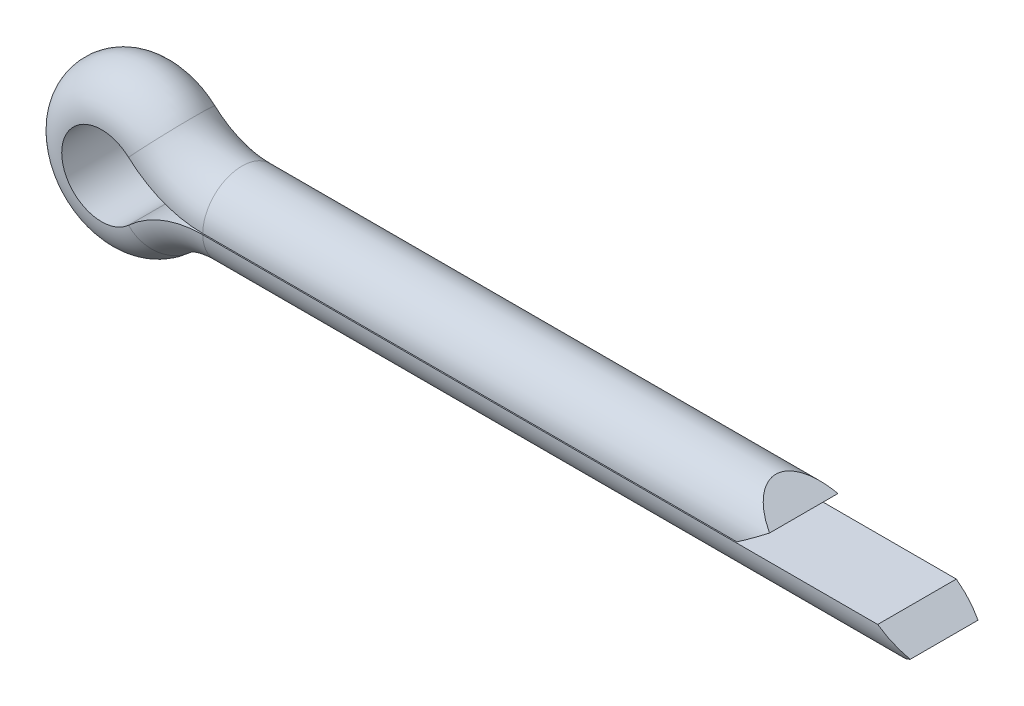
ISO-10303-21;
HEADER;
FILE_DESCRIPTION(('STEP AP214'),'2;1');
FILE_NAME('part.step','',(''),(''),'','','');
FILE_SCHEMA(('AUTOMOTIVE_DESIGN { 1 0 10303 214 1 1 1 1 }'));
ENDSEC;
DATA;
#1=APPLICATION_CONTEXT('core data for automotive mechanical design processes');
#2=APPLICATION_PROTOCOL_DEFINITION('international standard','automotive_design',2000,#1);
#3=PRODUCT_CONTEXT('',#1,'mechanical');
#4=PRODUCT('Part','Part','',(#3));
#5=PRODUCT_RELATED_PRODUCT_CATEGORY('part','',(#4));
#6=PRODUCT_DEFINITION_FORMATION('','',#4);
#7=PRODUCT_DEFINITION_CONTEXT('part definition',#1,'design');
#8=PRODUCT_DEFINITION('design','',#6,#7);
#9=PRODUCT_DEFINITION_SHAPE('','',#8);
#10=(LENGTH_UNIT() NAMED_UNIT(*) SI_UNIT(.MILLI.,.METRE.));
#11=(NAMED_UNIT(*) PLANE_ANGLE_UNIT() SI_UNIT($,.RADIAN.));
#12=(NAMED_UNIT(*) SI_UNIT($,.STERADIAN.) SOLID_ANGLE_UNIT());
#13=UNCERTAINTY_MEASURE_WITH_UNIT(LENGTH_MEASURE(1.E-05),#10,'distance_accuracy_value','');
#14=(GEOMETRIC_REPRESENTATION_CONTEXT(3) GLOBAL_UNCERTAINTY_ASSIGNED_CONTEXT((#13)) GLOBAL_UNIT_ASSIGNED_CONTEXT((#10,
#11,#12)) REPRESENTATION_CONTEXT('',''));
#15=CARTESIAN_POINT('',(0.,0.,0.));
#16=DIRECTION('',(0.,0.,1.));
#17=DIRECTION('',(1.,0.,0.));
#18=AXIS2_PLACEMENT_3D('',#15,#16,#17);
#19=CARTESIAN_POINT('',(1.80000000000001,0.,0.));
#20=DIRECTION('',(1.,0.,0.));
#21=DIRECTION('',(0.,0.,-1.));
#22=AXIS2_PLACEMENT_3D('',#19,#20,#21);
#23=CYLINDRICAL_SURFACE('',#22,0.7);
#24=CARTESIAN_POINT('',(13.8036492353313,0.,0.));
#25=DIRECTION('',(-0.58174128185548,-0.813373887572709,0.));
#26=DIRECTION('',(0.81337388757271,-0.58174128185548,0.));
#27=AXIS2_PLACEMENT_3D('',#24,#25,#26);
#28=ELLIPSE('',#27,1.20328404023062,0.7);
#29=CARTESIAN_POINT('',(14.3,-0.355,-0.603303406255912));
#30=VERTEX_POINT('',#29);
#31=CARTESIAN_POINT('',(13.8176309470121,-0.0100000000000003,-0.699928567783885));
#32=VERTEX_POINT('',#31);
#33=EDGE_CURVE('E175',#30,#32,#28,.F.);
#34=ORIENTED_EDGE('',*,*,#33,.F.);
#35=CARTESIAN_POINT('',(14.8179427774436,0.,0.));
#36=DIRECTION('',(-0.565354203493355,0.824848243371103,0.));
#37=DIRECTION('',(0.824848243371103,0.565354203493355,0.));
#38=AXIS2_PLACEMENT_3D('',#35,#36,#37);
#39=ELLIPSE('',#38,1.23816183849817,0.7);
#40=CARTESIAN_POINT('',(14.3,-0.355,0.603303406255911));
#41=VERTEX_POINT('',#40);
#42=EDGE_CURVE('E171',#41,#30,#39,.F.);
#43=ORIENTED_EDGE('',*,*,#42,.F.);
#44=CARTESIAN_POINT('',(13.8176309470121,-0.0100000000000004,0.699928567783885));
#45=VERTEX_POINT('',#44);
#46=EDGE_CURVE('E118',#45,#41,#28,.F.);
#47=ORIENTED_EDGE('',*,*,#46,.F.);
#48=DIRECTION('',(1.,0.,0.));
#49=VECTOR('',#48,1.);
#50=CARTESIAN_POINT('',(1.80000000000001,-0.0100000000000004,0.699928567783885));
#51=LINE('',#50,#49);
#52=CARTESIAN_POINT('',(1.80000000000001,-0.0100000000000004,0.699928567783885));
#53=VERTEX_POINT('',#52);
#54=EDGE_CURVE('E46',#53,#45,#51,.T.);
#55=ORIENTED_EDGE('',*,*,#54,.F.);
#56=CARTESIAN_POINT('',(1.80000000000001,0.,0.));
#57=DIRECTION('',(1.,0.,0.));
#58=DIRECTION('',(0.,0.,1.));
#59=AXIS2_PLACEMENT_3D('',#56,#57,#58);
#60=CIRCLE('',#59,0.7);
#61=CARTESIAN_POINT('',(1.80000000000001,-0.0100000000000004,-0.699928567783885));
#62=VERTEX_POINT('',#61);
#63=EDGE_CURVE('E153',#53,#62,#60,.T.);
#64=ORIENTED_EDGE('',*,*,#63,.T.);
#65=DIRECTION('',(1.,0.,0.));
#66=VECTOR('',#65,1.);
#67=CARTESIAN_POINT('',(1.80000000000001,-0.0100000000000004,-0.699928567783885));
#68=LINE('',#67,#66);
#69=EDGE_CURVE('E11',#62,#32,#68,.T.);
#70=ORIENTED_EDGE('',*,*,#69,.T.);
#71=EDGE_LOOP('',(#34,#43,#47,#55,#64,#70));
#72=FACE_BOUND('',#71,.T.);
#73=ADVANCED_FACE('F38',(#72),#23,.T.);
#74=CARTESIAN_POINT('',(1.80000000000001,-0.0100000000000004,-0.699928567783885));
#75=DIRECTION('',(0.,1.,0.));
#76=DIRECTION('',(0.,0.,1.));
#77=AXIS2_PLACEMENT_3D('',#74,#75,#76);
#78=PLANE('',#77);
#79=DIRECTION('',(0.,0.,1.));
#80=VECTOR('',#79,1.);
#81=CARTESIAN_POINT('',(13.8176309470121,-0.0100000000000004,-0.699928567783885));
#82=LINE('',#81,#80);
#83=EDGE_CURVE('E53',#32,#45,#82,.T.);
#84=ORIENTED_EDGE('',*,*,#83,.F.);
#85=ORIENTED_EDGE('',*,*,#69,.F.);
#86=DIRECTION('',(0.,0.,1.));
#87=VECTOR('',#86,1.);
#88=CARTESIAN_POINT('',(1.80000000000001,-0.0100000000000004,-0.699928567783885));
#89=LINE('',#88,#87);
#90=EDGE_CURVE('E156',#62,#53,#89,.T.);
#91=ORIENTED_EDGE('',*,*,#90,.T.);
#92=ORIENTED_EDGE('',*,*,#54,.T.);
#93=EDGE_LOOP('',(#84,#85,#91,#92));
#94=FACE_BOUND('',#93,.T.);
#95=ADVANCED_FACE('F40',(#94),#78,.T.);
#96=CARTESIAN_POINT('',(1.8,-1.96428571428571,0.));
#97=DIRECTION('',(0.,0.,-1.));
#98=DIRECTION('',(-1.,0.,0.));
#99=AXIS2_PLACEMENT_3D('',#96,#97,#98);
#100=CYLINDRICAL_SURFACE('',#99,1.95428571428571);
#101=DIRECTION('',(0.,0.,1.));
#102=VECTOR('',#101,1.);
#103=CARTESIAN_POINT('',(0.479678284182313,-0.523458445040208,-0.699928567783885));
#104=LINE('',#103,#102);
#105=CARTESIAN_POINT('',(0.479678284182313,-0.523458445040208,-0.699928567783885));
#106=VERTEX_POINT('',#105);
#107=CARTESIAN_POINT('',(0.479678284182313,-0.523458445040208,0.699928567783885));
#108=VERTEX_POINT('',#107);
#109=EDGE_CURVE('E144',#106,#108,#104,.T.);
#110=ORIENTED_EDGE('',*,*,#109,.T.);
#111=CARTESIAN_POINT('',(1.8,-1.96428571428571,0.699928567783885));
#112=DIRECTION('',(0.,0.,-1.));
#113=DIRECTION('',(-1.,0.,0.));
#114=AXIS2_PLACEMENT_3D('',#111,#112,#113);
#115=CIRCLE('',#114,1.95428571428571);
#116=EDGE_CURVE('E159',#108,#53,#115,.T.);
#117=ORIENTED_EDGE('',*,*,#116,.T.);
#118=ORIENTED_EDGE('',*,*,#90,.F.);
#119=CARTESIAN_POINT('',(1.8,-1.96428571428571,-0.699928567783885));
#120=DIRECTION('',(0.,0.,-1.));
#121=DIRECTION('',(-1.,0.,0.));
#122=AXIS2_PLACEMENT_3D('',#119,#120,#121);
#123=CIRCLE('',#122,1.95428571428571);
#124=EDGE_CURVE('E162',#106,#62,#123,.T.);
#125=ORIENTED_EDGE('',*,*,#124,.F.);
#126=EDGE_LOOP('',(#110,#117,#118,#125));
#127=FACE_BOUND('',#126,.T.);
#128=ADVANCED_FACE('F195',(#127),#100,.T.);
#129=CARTESIAN_POINT('',(1.8,-1.96428571428571,0.));
#130=DIRECTION('',(0.,0.,-1.));
#131=DIRECTION('',(-1.,0.,0.));
#132=AXIS2_PLACEMENT_3D('',#129,#130,#131);
#133=TOROIDAL_SURFACE('',#132,1.96428571428571,0.7);
#134=CARTESIAN_POINT('',(0.472922252010731,-0.516085790884712,0.));
#135=DIRECTION('',(0.737265415549588,0.675603217158188,0.));
#136=DIRECTION('',(0.,0.,1.));
#137=AXIS2_PLACEMENT_3D('',#134,#135,#136);
#138=CIRCLE('',#137,0.7);
#139=EDGE_CURVE('E141',#108,#106,#138,.T.);
#140=ORIENTED_EDGE('',*,*,#139,.T.);
#141=ORIENTED_EDGE('',*,*,#124,.T.);
#142=ORIENTED_EDGE('',*,*,#63,.F.);
#143=ORIENTED_EDGE('',*,*,#116,.F.);
#144=EDGE_LOOP('',(#140,#141,#142,#143));
#145=FACE_BOUND('',#144,.T.);
#146=ADVANCED_FACE('F197',(#145),#133,.T.);
#147=CARTESIAN_POINT('',(0.,0.,0.));
#148=DIRECTION('',(0.,0.,1.));
#149=DIRECTION('',(1.,0.,0.));
#150=AXIS2_PLACEMENT_3D('',#147,#148,#149);
#151=CYLINDRICAL_SURFACE('',#150,0.710000000000001);
#152=DIRECTION('',(0.,0.,1.));
#153=VECTOR('',#152,1.);
#154=CARTESIAN_POINT('',(0.479678284182307,0.523458445040215,-0.699928567783885));
#155=LINE('',#154,#153);
#156=CARTESIAN_POINT('',(0.479678284182307,0.523458445040215,-0.699928567783885));
#157=VERTEX_POINT('',#156);
#158=CARTESIAN_POINT('',(0.479678284182307,0.523458445040215,0.699928567783885));
#159=VERTEX_POINT('',#158);
#160=EDGE_CURVE('E128',#157,#159,#155,.T.);
#161=ORIENTED_EDGE('',*,*,#160,.T.);
#162=CARTESIAN_POINT('',(0.,0.,0.699928567783885));
#163=DIRECTION('',(0.,0.,1.));
#164=DIRECTION('',(1.,0.,0.));
#165=AXIS2_PLACEMENT_3D('',#162,#163,#164);
#166=CIRCLE('',#165,0.710000000000001);
#167=EDGE_CURVE('E147',#159,#108,#166,.T.);
#168=ORIENTED_EDGE('',*,*,#167,.T.);
#169=ORIENTED_EDGE('',*,*,#109,.F.);
#170=CARTESIAN_POINT('',(0.,0.,-0.699928567783885));
#171=DIRECTION('',(0.,0.,1.));
#172=DIRECTION('',(1.,0.,0.));
#173=AXIS2_PLACEMENT_3D('',#170,#171,#172);
#174=CIRCLE('',#173,0.710000000000001);
#175=EDGE_CURVE('E150',#157,#106,#174,.T.);
#176=ORIENTED_EDGE('',*,*,#175,.F.);
#177=EDGE_LOOP('',(#161,#168,#169,#176));
#178=FACE_BOUND('',#177,.T.);
#179=ADVANCED_FACE('F192',(#178),#151,.F.);
#180=CARTESIAN_POINT('',(0.,0.,0.));
#181=DIRECTION('',(0.,0.,1.));
#182=DIRECTION('',(1.,0.,0.));
#183=AXIS2_PLACEMENT_3D('',#180,#181,#182);
#184=TOROIDAL_SURFACE('',#183,0.700000000000001,0.7);
#185=CARTESIAN_POINT('',(0.472922252010725,0.516085790884719,0.));
#186=DIRECTION('',(-0.737265415549598,0.675603217158177,0.));
#187=DIRECTION('',(0.,0.,1.));
#188=AXIS2_PLACEMENT_3D('',#185,#186,#187);
#189=CIRCLE('',#188,0.7);
#190=EDGE_CURVE('E124',#159,#157,#189,.T.);
#191=ORIENTED_EDGE('',*,*,#190,.T.);
#192=ORIENTED_EDGE('',*,*,#175,.T.);
#193=ORIENTED_EDGE('',*,*,#139,.F.);
#194=ORIENTED_EDGE('',*,*,#167,.F.);
#195=EDGE_LOOP('',(#191,#192,#193,#194));
#196=FACE_BOUND('',#195,.T.);
#197=ADVANCED_FACE('F189',(#196),#184,.T.);
#198=CARTESIAN_POINT('',(1.8,1.96428571428571,0.));
#199=DIRECTION('',(0.,0.,-1.));
#200=DIRECTION('',(-1.,0.,0.));
#201=AXIS2_PLACEMENT_3D('',#198,#199,#200);
#202=CYLINDRICAL_SURFACE('',#201,1.95428571428571);
#203=DIRECTION('',(0.,0.,1.));
#204=VECTOR('',#203,1.);
#205=CARTESIAN_POINT('',(1.8,0.0100000000000001,-0.699928567783885));
#206=LINE('',#205,#204);
#207=CARTESIAN_POINT('',(1.8,0.0100000000000001,-0.699928567783885));
#208=VERTEX_POINT('',#207);
#209=CARTESIAN_POINT('',(1.8,0.0100000000000001,0.699928567783885));
#210=VERTEX_POINT('',#209);
#211=EDGE_CURVE('E123',#208,#210,#206,.T.);
#212=ORIENTED_EDGE('',*,*,#211,.T.);
#213=CARTESIAN_POINT('',(1.8,1.96428571428571,0.699928567783885));
#214=DIRECTION('',(0.,0.,-1.));
#215=DIRECTION('',(-1.,0.,0.));
#216=AXIS2_PLACEMENT_3D('',#213,#214,#215);
#217=CIRCLE('',#216,1.95428571428571);
#218=EDGE_CURVE('E135',#210,#159,#217,.T.);
#219=ORIENTED_EDGE('',*,*,#218,.T.);
#220=ORIENTED_EDGE('',*,*,#160,.F.);
#221=CARTESIAN_POINT('',(1.8,1.96428571428571,-0.699928567783885));
#222=DIRECTION('',(0.,0.,-1.));
#223=DIRECTION('',(-1.,0.,0.));
#224=AXIS2_PLACEMENT_3D('',#221,#222,#223);
#225=CIRCLE('',#224,1.95428571428571);
#226=EDGE_CURVE('E138',#208,#157,#225,.T.);
#227=ORIENTED_EDGE('',*,*,#226,.F.);
#228=EDGE_LOOP('',(#212,#219,#220,#227));
#229=FACE_BOUND('',#228,.T.);
#230=ADVANCED_FACE('F183',(#229),#202,.T.);
#231=CARTESIAN_POINT('',(1.8,1.96428571428571,0.));
#232=DIRECTION('',(0.,0.,-1.));
#233=DIRECTION('',(-1.,0.,0.));
#234=AXIS2_PLACEMENT_3D('',#231,#232,#233);
#235=TOROIDAL_SURFACE('',#234,1.96428571428571,0.7);
#236=CARTESIAN_POINT('',(1.8,0.,0.));
#237=DIRECTION('',(-1.,0.,0.));
#238=DIRECTION('',(0.,0.,1.));
#239=AXIS2_PLACEMENT_3D('',#236,#237,#238);
#240=CIRCLE('',#239,0.7);
#241=EDGE_CURVE('E177',#210,#208,#240,.T.);
#242=ORIENTED_EDGE('',*,*,#241,.T.);
#243=ORIENTED_EDGE('',*,*,#226,.T.);
#244=ORIENTED_EDGE('',*,*,#190,.F.);
#245=ORIENTED_EDGE('',*,*,#218,.F.);
#246=EDGE_LOOP('',(#242,#243,#244,#245));
#247=FACE_BOUND('',#246,.T.);
#248=ADVANCED_FACE('F186',(#247),#235,.T.);
#249=CARTESIAN_POINT('',(1.8,0.,0.));
#250=DIRECTION('',(1.,0.,0.));
#251=DIRECTION('',(0.,1.,0.));
#252=AXIS2_PLACEMENT_3D('',#249,#250,#251);
#253=CYLINDRICAL_SURFACE('',#252,0.7);
#254=DIRECTION('',(1.,0.,0.));
#255=VECTOR('',#254,1.);
#256=CARTESIAN_POINT('',(1.8,0.0100000000000001,0.699928567783885));
#257=LINE('',#256,#255);
#258=CARTESIAN_POINT('',(11.311237097342,0.01,0.699928567783885));
#259=VERTEX_POINT('',#258);
#260=EDGE_CURVE('E125',#210,#259,#257,.T.);
#261=ORIENTED_EDGE('',*,*,#260,.T.);
#262=CARTESIAN_POINT('',(11.2966471599492,0.,0.));
#263=DIRECTION('',(-0.565354203493355,0.824848243371103,0.));
#264=DIRECTION('',(0.824848243371103,0.565354203493355,0.));
#265=AXIS2_PLACEMENT_3D('',#262,#263,#264);
#266=ELLIPSE('',#265,1.23816183849817,0.7);
#267=CARTESIAN_POINT('',(11.8,0.345,0.609077170808428));
#268=VERTEX_POINT('',#267);
#269=EDGE_CURVE('E61',#259,#268,#266,.T.);
#270=ORIENTED_EDGE('',*,*,#269,.T.);
#271=CARTESIAN_POINT('',(12.2823690529879,0.,0.));
#272=DIRECTION('',(-0.58174128185548,-0.81337388757271,0.));
#273=DIRECTION('',(0.81337388757271,-0.58174128185548,0.));
#274=AXIS2_PLACEMENT_3D('',#271,#272,#273);
#275=ELLIPSE('',#274,1.20328404023062,0.7);
#276=CARTESIAN_POINT('',(11.8,0.345,-0.609077170808429));
#277=VERTEX_POINT('',#276);
#278=EDGE_CURVE('E111',#268,#277,#275,.T.);
#279=ORIENTED_EDGE('',*,*,#278,.T.);
#280=CARTESIAN_POINT('',(11.311237097342,0.0099999999999996,-0.699928567783885));
#281=VERTEX_POINT('',#280);
#282=EDGE_CURVE('E105',#277,#281,#266,.T.);
#283=ORIENTED_EDGE('',*,*,#282,.T.);
#284=DIRECTION('',(1.,0.,0.));
#285=VECTOR('',#284,1.);
#286=CARTESIAN_POINT('',(1.8,0.0100000000000001,-0.699928567783885));
#287=LINE('',#286,#285);
#288=EDGE_CURVE('E117',#208,#281,#287,.T.);
#289=ORIENTED_EDGE('',*,*,#288,.F.);
#290=ORIENTED_EDGE('',*,*,#241,.F.);
#291=EDGE_LOOP('',(#261,#270,#279,#283,#289,#290));
#292=FACE_BOUND('',#291,.T.);
#293=ADVANCED_FACE('F115',(#292),#253,.T.);
#294=CARTESIAN_POINT('',(1.8,0.0100000000000001,-0.699928567783885));
#295=DIRECTION('',(0.,1.,0.));
#296=DIRECTION('',(-1.,0.,0.));
#297=AXIS2_PLACEMENT_3D('',#294,#295,#296);
#298=PLANE('',#297);
#299=ORIENTED_EDGE('',*,*,#288,.T.);
#300=DIRECTION('',(0.,0.,1.));
#301=VECTOR('',#300,1.);
#302=CARTESIAN_POINT('',(11.311237097342,0.01,-0.699928567783885));
#303=LINE('',#302,#301);
#304=EDGE_CURVE('E102',#281,#259,#303,.T.);
#305=ORIENTED_EDGE('',*,*,#304,.T.);
#306=ORIENTED_EDGE('',*,*,#260,.F.);
#307=ORIENTED_EDGE('',*,*,#211,.F.);
#308=EDGE_LOOP('',(#299,#305,#306,#307));
#309=FACE_BOUND('',#308,.T.);
#310=ADVANCED_FACE('F121',(#309),#298,.F.);
#311=CARTESIAN_POINT('',(11.8,0.345,-0.699928567783885));
#312=DIRECTION('',(-0.565354203493355,0.824848243371103,0.));
#313=DIRECTION('',(-0.824848243371103,-0.565354203493355,0.));
#314=AXIS2_PLACEMENT_3D('',#311,#312,#313);
#315=PLANE('',#314);
#316=DIRECTION('',(0.,0.,1.));
#317=VECTOR('',#316,1.);
#318=CARTESIAN_POINT('',(11.8,0.345,-0.699928567783885));
#319=LINE('',#318,#317);
#320=EDGE_CURVE('E340',#277,#268,#319,.T.);
#321=ORIENTED_EDGE('',*,*,#320,.T.);
#322=ORIENTED_EDGE('',*,*,#269,.F.);
#323=ORIENTED_EDGE('',*,*,#304,.F.);
#324=ORIENTED_EDGE('',*,*,#282,.F.);
#325=EDGE_LOOP('',(#321,#322,#323,#324));
#326=FACE_BOUND('',#325,.T.);
#327=ADVANCED_FACE('F104',(#326),#315,.F.);
#328=CARTESIAN_POINT('',(11.8,0.345,-0.699928567783885));
#329=DIRECTION('',(-0.58174128185548,-0.81337388757271,0.));
#330=DIRECTION('',(0.81337388757271,-0.58174128185548,0.));
#331=AXIS2_PLACEMENT_3D('',#328,#329,#330);
#332=PLANE('',#331);
#333=ORIENTED_EDGE('',*,*,#320,.F.);
#334=ORIENTED_EDGE('',*,*,#278,.F.);
#335=EDGE_LOOP('',(#333,#334));
#336=FACE_BOUND('',#335,.T.);
#337=ADVANCED_FACE('F278',(#336),#332,.F.);
#338=CARTESIAN_POINT('',(14.3,-0.355,-0.699928567783885));
#339=DIRECTION('',(-0.565354203493355,0.824848243371103,0.));
#340=DIRECTION('',(-0.824848243371103,-0.565354203493355,0.));
#341=AXIS2_PLACEMENT_3D('',#338,#339,#340);
#342=PLANE('',#341);
#343=ORIENTED_EDGE('',*,*,#42,.T.);
#344=DIRECTION('',(0.,0.,1.));
#345=VECTOR('',#344,1.);
#346=CARTESIAN_POINT('',(14.3,-0.355,-0.699928567783885));
#347=LINE('',#346,#345);
#348=EDGE_CURVE('E341',#30,#41,#347,.T.);
#349=ORIENTED_EDGE('',*,*,#348,.T.);
#350=EDGE_LOOP('',(#343,#349));
#351=FACE_BOUND('',#350,.T.);
#352=ADVANCED_FACE('F287',(#351),#342,.F.);
#353=CARTESIAN_POINT('',(14.3,-0.355,-0.699928567783885));
#354=DIRECTION('',(-0.58174128185548,-0.813373887572709,0.));
#355=DIRECTION('',(0.81337388757271,-0.58174128185548,0.));
#356=AXIS2_PLACEMENT_3D('',#353,#354,#355);
#357=PLANE('',#356);
#358=ORIENTED_EDGE('',*,*,#33,.T.);
#359=ORIENTED_EDGE('',*,*,#83,.T.);
#360=ORIENTED_EDGE('',*,*,#46,.T.);
#361=ORIENTED_EDGE('',*,*,#348,.F.);
#362=EDGE_LOOP('',(#358,#359,#360,#361));
#363=FACE_BOUND('',#362,.T.);
#364=ADVANCED_FACE('F297',(#363),#357,.F.);
#365=CLOSED_SHELL('',(#73,#95,#128,#146,#179,#197,#230,#248,#293,#310,#327,#337,#352,#364));
#366=MANIFOLD_SOLID_BREP('B2',#365);
#367=ADVANCED_BREP_SHAPE_REPRESENTATION('',(#18,#366),#14);
#368=SHAPE_DEFINITION_REPRESENTATION(#9,#367);
ENDSEC;
END-ISO-10303-21;
